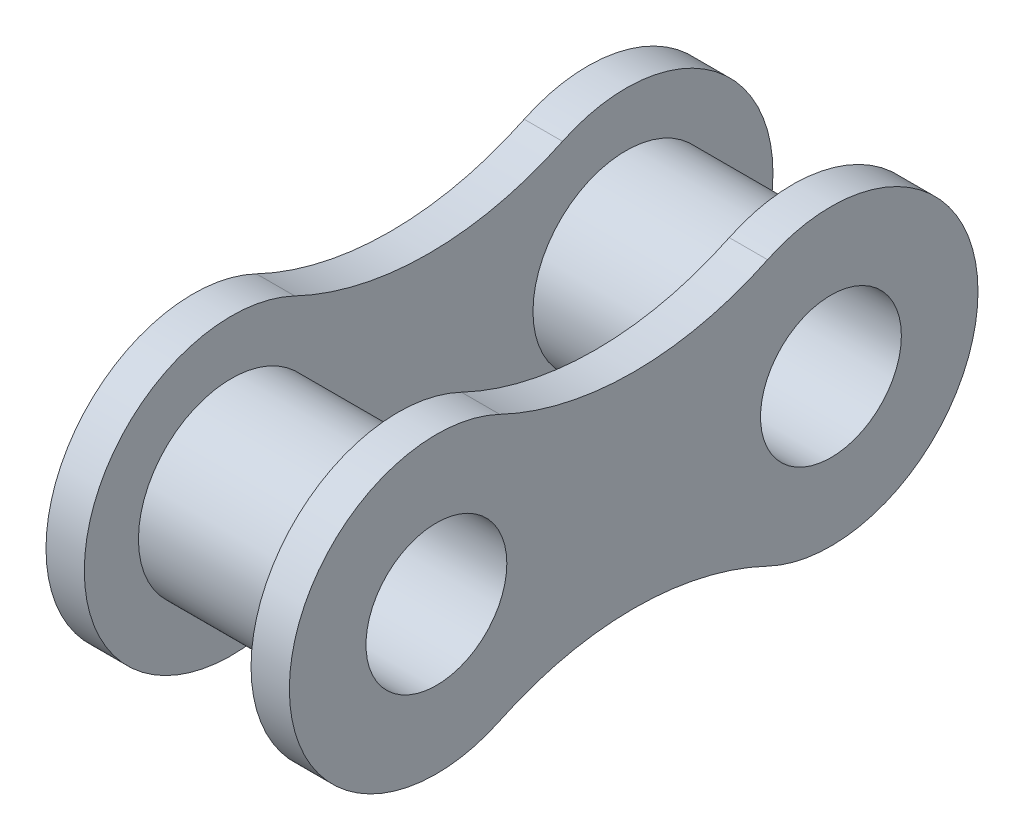
ISO-10303-21;
HEADER;
FILE_DESCRIPTION(('STEP AP214'),'2;1');
FILE_NAME('part.step','',(''),(''),'','','');
FILE_SCHEMA(('AUTOMOTIVE_DESIGN { 1 0 10303 214 1 1 1 1 }'));
ENDSEC;
DATA;
#1=APPLICATION_CONTEXT('core data for automotive mechanical design processes');
#2=APPLICATION_PROTOCOL_DEFINITION('international standard','automotive_design',2000,#1);
#3=PRODUCT_CONTEXT('',#1,'mechanical');
#4=PRODUCT('Part','Part','',(#3));
#5=PRODUCT_RELATED_PRODUCT_CATEGORY('part','',(#4));
#6=PRODUCT_DEFINITION_FORMATION('','',#4);
#7=PRODUCT_DEFINITION_CONTEXT('part definition',#1,'design');
#8=PRODUCT_DEFINITION('design','',#6,#7);
#9=PRODUCT_DEFINITION_SHAPE('','',#8);
#10=(LENGTH_UNIT() NAMED_UNIT(*) SI_UNIT(.MILLI.,.METRE.));
#11=(NAMED_UNIT(*) PLANE_ANGLE_UNIT() SI_UNIT($,.RADIAN.));
#12=(NAMED_UNIT(*) SI_UNIT($,.STERADIAN.) SOLID_ANGLE_UNIT());
#13=UNCERTAINTY_MEASURE_WITH_UNIT(LENGTH_MEASURE(1.E-05),#10,'distance_accuracy_value','');
#14=(GEOMETRIC_REPRESENTATION_CONTEXT(3) GLOBAL_UNCERTAINTY_ASSIGNED_CONTEXT((#13)) GLOBAL_UNIT_ASSIGNED_CONTEXT((#10,
#11,#12)) REPRESENTATION_CONTEXT('',''));
#15=CARTESIAN_POINT('',(0.,0.,0.));
#16=DIRECTION('',(0.,0.,1.));
#17=DIRECTION('',(1.,0.,0.));
#18=AXIS2_PLACEMENT_3D('',#15,#16,#17);
#19=CARTESIAN_POINT('',(11.75,0.,19.05));
#20=DIRECTION('',(-1.,0.,0.));
#21=DIRECTION('',(0.,0.,1.));
#22=AXIS2_PLACEMENT_3D('',#19,#20,#21);
#23=CYLINDRICAL_SURFACE('',#22,8.975);
#24=CARTESIAN_POINT('',(8.05,0.,19.05));
#25=DIRECTION('',(1.,0.,0.));
#26=DIRECTION('',(0.,0.,-1.));
#27=AXIS2_PLACEMENT_3D('',#24,#25,#26);
#28=CIRCLE('',#27,8.975);
#29=CARTESIAN_POINT('',(8.05,0.,10.075));
#30=VERTEX_POINT('',#29);
#31=EDGE_CURVE('E195',#30,#30,#28,.T.);
#32=ORIENTED_EDGE('',*,*,#31,.F.);
#33=EDGE_LOOP('',(#32));
#34=FACE_BOUND('',#33,.T.);
#35=CARTESIAN_POINT('',(-8.05,0.,19.05));
#36=DIRECTION('',(-1.,0.,0.));
#37=DIRECTION('',(0.,0.,1.));
#38=AXIS2_PLACEMENT_3D('',#35,#36,#37);
#39=CIRCLE('',#38,8.975);
#40=CARTESIAN_POINT('',(-8.05,0.,28.025));
#41=VERTEX_POINT('',#40);
#42=EDGE_CURVE('E11',#41,#41,#39,.T.);
#43=ORIENTED_EDGE('',*,*,#42,.F.);
#44=EDGE_LOOP('',(#43));
#45=FACE_BOUND('',#44,.T.);
#46=ADVANCED_FACE('F41',(#34,#45),#23,.T.);
#47=CARTESIAN_POINT('',(11.75,0.,-19.05));
#48=DIRECTION('',(-1.,0.,0.));
#49=DIRECTION('',(0.,0.,1.));
#50=AXIS2_PLACEMENT_3D('',#47,#48,#49);
#51=CYLINDRICAL_SURFACE('',#50,8.975);
#52=CARTESIAN_POINT('',(8.05,0.,-19.05));
#53=DIRECTION('',(1.,0.,0.));
#54=DIRECTION('',(0.,0.,-1.));
#55=AXIS2_PLACEMENT_3D('',#52,#53,#54);
#56=CIRCLE('',#55,8.975);
#57=CARTESIAN_POINT('',(8.05,0.,-28.025));
#58=VERTEX_POINT('',#57);
#59=EDGE_CURVE('E162',#58,#58,#56,.F.);
#60=ORIENTED_EDGE('',*,*,#59,.T.);
#61=EDGE_LOOP('',(#60));
#62=FACE_BOUND('',#61,.T.);
#63=CARTESIAN_POINT('',(-8.05,0.,-19.05));
#64=DIRECTION('',(-1.,0.,0.));
#65=DIRECTION('',(0.,0.,1.));
#66=AXIS2_PLACEMENT_3D('',#63,#64,#65);
#67=CIRCLE('',#66,8.975);
#68=CARTESIAN_POINT('',(-8.05,0.,-10.075));
#69=VERTEX_POINT('',#68);
#70=EDGE_CURVE('E49',#69,#69,#67,.T.);
#71=ORIENTED_EDGE('',*,*,#70,.F.);
#72=EDGE_LOOP('',(#71));
#73=FACE_BOUND('',#72,.T.);
#74=ADVANCED_FACE('F203',(#62,#73),#51,.T.);
#75=CARTESIAN_POINT('',(11.75,0.,19.05));
#76=DIRECTION('',(1.,0.,0.));
#77=DIRECTION('',(0.,0.,-1.));
#78=AXIS2_PLACEMENT_3D('',#75,#76,#77);
#79=PLANE('',#78);
#80=CARTESIAN_POINT('',(11.75,0.,19.05));
#81=DIRECTION('',(1.,0.,0.));
#82=DIRECTION('',(0.,0.,-1.));
#83=AXIS2_PLACEMENT_3D('',#80,#81,#82);
#84=CIRCLE('',#83,6.8);
#85=CARTESIAN_POINT('',(11.75,0.,12.25));
#86=VERTEX_POINT('',#85);
#87=EDGE_CURVE('E192',#86,#86,#84,.T.);
#88=ORIENTED_EDGE('',*,*,#87,.F.);
#89=EDGE_LOOP('',(#88));
#90=FACE_BOUND('',#89,.T.);
#91=CARTESIAN_POINT('',(11.75,39.8840506969891,0.));
#92=DIRECTION('',(-1.,0.,0.));
#93=DIRECTION('',(0.,0.,-1.));
#94=AXIS2_PLACEMENT_3D('',#91,#92,#93);
#95=CIRCLE('',#94,30.);
#96=CARTESIAN_POINT('',(11.75,12.8134280519739,-12.9298642533937));
#97=VERTEX_POINT('',#96);
#98=CARTESIAN_POINT('',(11.75,12.8134280519739,12.9298642533937));
#99=VERTEX_POINT('',#98);
#100=EDGE_CURVE('E167',#97,#99,#95,.T.);
#101=ORIENTED_EDGE('',*,*,#100,.T.);
#102=CARTESIAN_POINT('',(11.75,0.,19.05));
#103=DIRECTION('',(1.,0.,0.));
#104=DIRECTION('',(0.,0.,-1.));
#105=AXIS2_PLACEMENT_3D('',#102,#103,#104);
#106=CIRCLE('',#105,14.2);
#107=CARTESIAN_POINT('',(11.75,-12.8134280519739,12.9298642533937));
#108=VERTEX_POINT('',#107);
#109=EDGE_CURVE('E179',#99,#108,#106,.T.);
#110=ORIENTED_EDGE('',*,*,#109,.T.);
#111=CARTESIAN_POINT('',(11.75,-39.8840506969891,0.));
#112=DIRECTION('',(-1.,0.,0.));
#113=DIRECTION('',(0.,0.,-1.));
#114=AXIS2_PLACEMENT_3D('',#111,#112,#113);
#115=CIRCLE('',#114,30.);
#116=CARTESIAN_POINT('',(11.75,-12.8134280519739,-12.9298642533937));
#117=VERTEX_POINT('',#116);
#118=EDGE_CURVE('E182',#108,#117,#115,.T.);
#119=ORIENTED_EDGE('',*,*,#118,.T.);
#120=CARTESIAN_POINT('',(11.75,0.,-19.05));
#121=DIRECTION('',(1.,0.,0.));
#122=DIRECTION('',(0.,0.,-1.));
#123=AXIS2_PLACEMENT_3D('',#120,#121,#122);
#124=CIRCLE('',#123,14.2);
#125=EDGE_CURVE('E171',#117,#97,#124,.T.);
#126=ORIENTED_EDGE('',*,*,#125,.T.);
#127=EDGE_LOOP('',(#101,#110,#119,#126));
#128=FACE_BOUND('',#127,.T.);
#129=CARTESIAN_POINT('',(11.75,0.,-19.05));
#130=DIRECTION('',(1.,0.,0.));
#131=DIRECTION('',(0.,0.,-1.));
#132=AXIS2_PLACEMENT_3D('',#129,#130,#131);
#133=CIRCLE('',#132,6.8);
#134=CARTESIAN_POINT('',(11.75,0.,-25.85));
#135=VERTEX_POINT('',#134);
#136=EDGE_CURVE('E154',#135,#135,#133,.T.);
#137=ORIENTED_EDGE('',*,*,#136,.F.);
#138=EDGE_LOOP('',(#137));
#139=FACE_BOUND('',#138,.T.);
#140=ADVANCED_FACE('F205',(#90,#128,#139),#79,.T.);
#141=CARTESIAN_POINT('',(-11.75,0.,19.05));
#142=DIRECTION('',(1.,0.,0.));
#143=DIRECTION('',(0.,0.,-1.));
#144=AXIS2_PLACEMENT_3D('',#141,#142,#143);
#145=PLANE('',#144);
#146=CARTESIAN_POINT('',(-11.75,0.,19.05));
#147=DIRECTION('',(1.,0.,0.));
#148=DIRECTION('',(0.,0.,-1.));
#149=AXIS2_PLACEMENT_3D('',#146,#147,#148);
#150=CIRCLE('',#149,6.8);
#151=CARTESIAN_POINT('',(-11.75,0.,12.25));
#152=VERTEX_POINT('',#151);
#153=EDGE_CURVE('E187',#152,#152,#150,.T.);
#154=ORIENTED_EDGE('',*,*,#153,.T.);
#155=EDGE_LOOP('',(#154));
#156=FACE_BOUND('',#155,.T.);
#157=CARTESIAN_POINT('',(-11.75,0.,-19.05));
#158=DIRECTION('',(1.,0.,0.));
#159=DIRECTION('',(0.,0.,-1.));
#160=AXIS2_PLACEMENT_3D('',#157,#158,#159);
#161=CIRCLE('',#160,6.8);
#162=CARTESIAN_POINT('',(-11.75,0.,-25.85));
#163=VERTEX_POINT('',#162);
#164=EDGE_CURVE('E159',#163,#163,#161,.T.);
#165=ORIENTED_EDGE('',*,*,#164,.T.);
#166=EDGE_LOOP('',(#165));
#167=FACE_BOUND('',#166,.T.);
#168=CARTESIAN_POINT('',(-11.75,39.8840506969891,0.));
#169=DIRECTION('',(-1.,0.,0.));
#170=DIRECTION('',(0.,0.,-1.));
#171=AXIS2_PLACEMENT_3D('',#168,#169,#170);
#172=CIRCLE('',#171,30.);
#173=CARTESIAN_POINT('',(-11.75,12.8134280519739,-12.9298642533937));
#174=VERTEX_POINT('',#173);
#175=CARTESIAN_POINT('',(-11.75,12.8134280519739,12.9298642533937));
#176=VERTEX_POINT('',#175);
#177=EDGE_CURVE('E149',#174,#176,#172,.T.);
#178=ORIENTED_EDGE('',*,*,#177,.F.);
#179=CARTESIAN_POINT('',(-11.75,0.,-19.05));
#180=DIRECTION('',(1.,0.,0.));
#181=DIRECTION('',(0.,0.,-1.));
#182=AXIS2_PLACEMENT_3D('',#179,#180,#181);
#183=CIRCLE('',#182,14.2);
#184=CARTESIAN_POINT('',(-11.75,-12.8134280519739,-12.9298642533937));
#185=VERTEX_POINT('',#184);
#186=EDGE_CURVE('E132',#185,#174,#183,.T.);
#187=ORIENTED_EDGE('',*,*,#186,.F.);
#188=CARTESIAN_POINT('',(-11.75,-39.8840506969891,0.));
#189=DIRECTION('',(-1.,0.,0.));
#190=DIRECTION('',(0.,0.,-1.));
#191=AXIS2_PLACEMENT_3D('',#188,#189,#190);
#192=CIRCLE('',#191,30.);
#193=CARTESIAN_POINT('',(-11.75,-12.8134280519739,12.9298642533937));
#194=VERTEX_POINT('',#193);
#195=EDGE_CURVE('E144',#194,#185,#192,.T.);
#196=ORIENTED_EDGE('',*,*,#195,.F.);
#197=CARTESIAN_POINT('',(-11.75,0.,19.05));
#198=DIRECTION('',(1.,0.,0.));
#199=DIRECTION('',(0.,0.,-1.));
#200=AXIS2_PLACEMENT_3D('',#197,#198,#199);
#201=CIRCLE('',#200,14.2);
#202=EDGE_CURVE('E142',#176,#194,#201,.T.);
#203=ORIENTED_EDGE('',*,*,#202,.F.);
#204=EDGE_LOOP('',(#178,#187,#196,#203));
#205=FACE_BOUND('',#204,.T.);
#206=ADVANCED_FACE('F213',(#156,#167,#205),#145,.F.);
#207=CARTESIAN_POINT('',(11.75,0.,19.05));
#208=DIRECTION('',(-1.,0.,0.));
#209=DIRECTION('',(0.,0.,1.));
#210=AXIS2_PLACEMENT_3D('',#207,#208,#209);
#211=CYLINDRICAL_SURFACE('',#210,6.8);
#212=ORIENTED_EDGE('',*,*,#87,.T.);
#213=EDGE_LOOP('',(#212));
#214=FACE_BOUND('',#213,.T.);
#215=ORIENTED_EDGE('',*,*,#153,.F.);
#216=EDGE_LOOP('',(#215));
#217=FACE_BOUND('',#216,.T.);
#218=ADVANCED_FACE('F240',(#214,#217),#211,.F.);
#219=CARTESIAN_POINT('',(8.05,39.8840506969891,0.));
#220=DIRECTION('',(1.,0.,0.));
#221=DIRECTION('',(0.,0.,-1.));
#222=AXIS2_PLACEMENT_3D('',#219,#220,#221);
#223=CYLINDRICAL_SURFACE('',#222,30.);
#224=ORIENTED_EDGE('',*,*,#100,.F.);
#225=DIRECTION('',(1.,0.,0.));
#226=VECTOR('',#225,1.);
#227=CARTESIAN_POINT('',(8.05,12.8134280519739,-12.9298642533937));
#228=LINE('',#227,#226);
#229=CARTESIAN_POINT('',(8.05,12.8134280519739,-12.9298642533937));
#230=VERTEX_POINT('',#229);
#231=EDGE_CURVE('E57',#230,#97,#228,.T.);
#232=ORIENTED_EDGE('',*,*,#231,.F.);
#233=CARTESIAN_POINT('',(8.05,39.8840506969891,0.));
#234=DIRECTION('',(-1.,0.,0.));
#235=DIRECTION('',(0.,0.,-1.));
#236=AXIS2_PLACEMENT_3D('',#233,#234,#235);
#237=CIRCLE('',#236,30.);
#238=CARTESIAN_POINT('',(8.05,12.8134280519739,12.9298642533937));
#239=VERTEX_POINT('',#238);
#240=EDGE_CURVE('E168',#230,#239,#237,.T.);
#241=ORIENTED_EDGE('',*,*,#240,.T.);
#242=DIRECTION('',(1.,0.,0.));
#243=VECTOR('',#242,1.);
#244=CARTESIAN_POINT('',(8.05,12.8134280519739,12.9298642533937));
#245=LINE('',#244,#243);
#246=EDGE_CURVE('E86',#239,#99,#245,.T.);
#247=ORIENTED_EDGE('',*,*,#246,.T.);
#248=EDGE_LOOP('',(#224,#232,#241,#247));
#249=FACE_BOUND('',#248,.T.);
#250=ADVANCED_FACE('F233',(#249),#223,.F.);
#251=CARTESIAN_POINT('',(8.05,0.,-19.05));
#252=DIRECTION('',(1.,0.,0.));
#253=DIRECTION('',(0.,0.,-1.));
#254=AXIS2_PLACEMENT_3D('',#251,#252,#253);
#255=CYLINDRICAL_SURFACE('',#254,14.2);
#256=ORIENTED_EDGE('',*,*,#125,.F.);
#257=DIRECTION('',(1.,0.,0.));
#258=VECTOR('',#257,1.);
#259=CARTESIAN_POINT('',(8.05,-12.8134280519739,-12.9298642533937));
#260=LINE('',#259,#258);
#261=CARTESIAN_POINT('',(8.05,-12.8134280519739,-12.9298642533937));
#262=VERTEX_POINT('',#261);
#263=EDGE_CURVE('E75',#262,#117,#260,.T.);
#264=ORIENTED_EDGE('',*,*,#263,.F.);
#265=CARTESIAN_POINT('',(8.05,0.,-19.05));
#266=DIRECTION('',(1.,0.,0.));
#267=DIRECTION('',(0.,0.,-1.));
#268=AXIS2_PLACEMENT_3D('',#265,#266,#267);
#269=CIRCLE('',#268,14.2);
#270=EDGE_CURVE('E175',#262,#230,#269,.T.);
#271=ORIENTED_EDGE('',*,*,#270,.T.);
#272=ORIENTED_EDGE('',*,*,#231,.T.);
#273=EDGE_LOOP('',(#256,#264,#271,#272));
#274=FACE_BOUND('',#273,.T.);
#275=ADVANCED_FACE('F229',(#274),#255,.T.);
#276=CARTESIAN_POINT('',(8.05,-39.8840506969891,0.));
#277=DIRECTION('',(1.,0.,0.));
#278=DIRECTION('',(0.,0.,-1.));
#279=AXIS2_PLACEMENT_3D('',#276,#277,#278);
#280=CYLINDRICAL_SURFACE('',#279,30.);
#281=ORIENTED_EDGE('',*,*,#118,.F.);
#282=DIRECTION('',(1.,0.,0.));
#283=VECTOR('',#282,1.);
#284=CARTESIAN_POINT('',(8.05,-12.8134280519739,12.9298642533937));
#285=LINE('',#284,#283);
#286=CARTESIAN_POINT('',(8.05,-12.8134280519739,12.9298642533937));
#287=VERTEX_POINT('',#286);
#288=EDGE_CURVE('E189',#287,#108,#285,.T.);
#289=ORIENTED_EDGE('',*,*,#288,.F.);
#290=CARTESIAN_POINT('',(8.05,-39.8840506969891,0.));
#291=DIRECTION('',(-1.,0.,0.));
#292=DIRECTION('',(0.,0.,-1.));
#293=AXIS2_PLACEMENT_3D('',#290,#291,#292);
#294=CIRCLE('',#293,30.);
#295=EDGE_CURVE('E173',#287,#262,#294,.T.);
#296=ORIENTED_EDGE('',*,*,#295,.T.);
#297=ORIENTED_EDGE('',*,*,#263,.T.);
#298=EDGE_LOOP('',(#281,#289,#296,#297));
#299=FACE_BOUND('',#298,.T.);
#300=ADVANCED_FACE('F232',(#299),#280,.F.);
#301=CARTESIAN_POINT('',(8.05,0.,19.05));
#302=DIRECTION('',(1.,0.,0.));
#303=DIRECTION('',(0.,0.,-1.));
#304=AXIS2_PLACEMENT_3D('',#301,#302,#303);
#305=CYLINDRICAL_SURFACE('',#304,14.2);
#306=ORIENTED_EDGE('',*,*,#109,.F.);
#307=ORIENTED_EDGE('',*,*,#246,.F.);
#308=CARTESIAN_POINT('',(8.05,0.,19.05));
#309=DIRECTION('',(1.,0.,0.));
#310=DIRECTION('',(0.,0.,-1.));
#311=AXIS2_PLACEMENT_3D('',#308,#309,#310);
#312=CIRCLE('',#311,14.2);
#313=EDGE_CURVE('E170',#239,#287,#312,.T.);
#314=ORIENTED_EDGE('',*,*,#313,.T.);
#315=ORIENTED_EDGE('',*,*,#288,.T.);
#316=EDGE_LOOP('',(#306,#307,#314,#315));
#317=FACE_BOUND('',#316,.T.);
#318=ADVANCED_FACE('F227',(#317),#305,.T.);
#319=CARTESIAN_POINT('',(8.05,19.9420253484946,-9.525));
#320=DIRECTION('',(1.,0.,0.));
#321=DIRECTION('',(0.,0.,-1.));
#322=AXIS2_PLACEMENT_3D('',#319,#320,#321);
#323=PLANE('',#322);
#324=ORIENTED_EDGE('',*,*,#59,.F.);
#325=EDGE_LOOP('',(#324));
#326=FACE_BOUND('',#325,.T.);
#327=ORIENTED_EDGE('',*,*,#31,.T.);
#328=EDGE_LOOP('',(#327));
#329=FACE_BOUND('',#328,.T.);
#330=ORIENTED_EDGE('',*,*,#240,.F.);
#331=ORIENTED_EDGE('',*,*,#270,.F.);
#332=ORIENTED_EDGE('',*,*,#295,.F.);
#333=ORIENTED_EDGE('',*,*,#313,.F.);
#334=EDGE_LOOP('',(#330,#331,#332,#333));
#335=FACE_BOUND('',#334,.T.);
#336=ADVANCED_FACE('F223',(#326,#329,#335),#323,.F.);
#337=CARTESIAN_POINT('',(11.75,0.,-19.05));
#338=DIRECTION('',(-1.,0.,0.));
#339=DIRECTION('',(0.,0.,1.));
#340=AXIS2_PLACEMENT_3D('',#337,#338,#339);
#341=CYLINDRICAL_SURFACE('',#340,6.8);
#342=ORIENTED_EDGE('',*,*,#136,.T.);
#343=EDGE_LOOP('',(#342));
#344=FACE_BOUND('',#343,.T.);
#345=ORIENTED_EDGE('',*,*,#164,.F.);
#346=EDGE_LOOP('',(#345));
#347=FACE_BOUND('',#346,.T.);
#348=ADVANCED_FACE('F220',(#344,#347),#341,.F.);
#349=CARTESIAN_POINT('',(-8.05,19.9420253484946,-9.525));
#350=DIRECTION('',(-1.,0.,0.));
#351=DIRECTION('',(0.,0.,-1.));
#352=AXIS2_PLACEMENT_3D('',#349,#350,#351);
#353=PLANE('',#352);
#354=CARTESIAN_POINT('',(-8.05,39.8840506969891,0.));
#355=DIRECTION('',(-1.,0.,0.));
#356=DIRECTION('',(0.,0.,-1.));
#357=AXIS2_PLACEMENT_3D('',#354,#355,#356);
#358=CIRCLE('',#357,30.);
#359=CARTESIAN_POINT('',(-8.05,12.8134280519739,-12.9298642533937));
#360=VERTEX_POINT('',#359);
#361=CARTESIAN_POINT('',(-8.05,12.8134280519739,12.9298642533937));
#362=VERTEX_POINT('',#361);
#363=EDGE_CURVE('E120',#360,#362,#358,.T.);
#364=ORIENTED_EDGE('',*,*,#363,.T.);
#365=CARTESIAN_POINT('',(-8.05,0.,19.05));
#366=DIRECTION('',(1.,0.,0.));
#367=DIRECTION('',(0.,0.,-1.));
#368=AXIS2_PLACEMENT_3D('',#365,#366,#367);
#369=CIRCLE('',#368,14.2);
#370=CARTESIAN_POINT('',(-8.05,-12.8134280519739,12.9298642533937));
#371=VERTEX_POINT('',#370);
#372=EDGE_CURVE('E137',#362,#371,#369,.T.);
#373=ORIENTED_EDGE('',*,*,#372,.T.);
#374=CARTESIAN_POINT('',(-8.05,-39.8840506969891,0.));
#375=DIRECTION('',(-1.,0.,0.));
#376=DIRECTION('',(0.,0.,-1.));
#377=AXIS2_PLACEMENT_3D('',#374,#375,#376);
#378=CIRCLE('',#377,30.);
#379=CARTESIAN_POINT('',(-8.05,-12.8134280519739,-12.9298642533937));
#380=VERTEX_POINT('',#379);
#381=EDGE_CURVE('E123',#371,#380,#378,.T.);
#382=ORIENTED_EDGE('',*,*,#381,.T.);
#383=CARTESIAN_POINT('',(-8.05,0.,-19.05));
#384=DIRECTION('',(1.,0.,0.));
#385=DIRECTION('',(0.,0.,-1.));
#386=AXIS2_PLACEMENT_3D('',#383,#384,#385);
#387=CIRCLE('',#386,14.2);
#388=EDGE_CURVE('E115',#380,#360,#387,.T.);
#389=ORIENTED_EDGE('',*,*,#388,.T.);
#390=EDGE_LOOP('',(#364,#373,#382,#389));
#391=FACE_BOUND('',#390,.T.);
#392=ORIENTED_EDGE('',*,*,#42,.T.);
#393=EDGE_LOOP('',(#392));
#394=FACE_BOUND('',#393,.T.);
#395=ORIENTED_EDGE('',*,*,#70,.T.);
#396=EDGE_LOOP('',(#395));
#397=FACE_BOUND('',#396,.T.);
#398=ADVANCED_FACE('F117',(#391,#394,#397),#353,.F.);
#399=CARTESIAN_POINT('',(-8.05,39.8840506969891,0.));
#400=DIRECTION('',(-1.,0.,0.));
#401=DIRECTION('',(0.,0.,1.));
#402=AXIS2_PLACEMENT_3D('',#399,#400,#401);
#403=CYLINDRICAL_SURFACE('',#402,30.);
#404=ORIENTED_EDGE('',*,*,#177,.T.);
#405=DIRECTION('',(-1.,0.,0.));
#406=VECTOR('',#405,1.);
#407=CARTESIAN_POINT('',(-8.05,12.8134280519739,12.9298642533937));
#408=LINE('',#407,#406);
#409=EDGE_CURVE('E141',#362,#176,#408,.T.);
#410=ORIENTED_EDGE('',*,*,#409,.F.);
#411=ORIENTED_EDGE('',*,*,#363,.F.);
#412=DIRECTION('',(-1.,0.,0.));
#413=VECTOR('',#412,1.);
#414=CARTESIAN_POINT('',(-8.05,12.8134280519739,-12.9298642533937));
#415=LINE('',#414,#413);
#416=EDGE_CURVE('E129',#360,#174,#415,.T.);
#417=ORIENTED_EDGE('',*,*,#416,.T.);
#418=EDGE_LOOP('',(#404,#410,#411,#417));
#419=FACE_BOUND('',#418,.T.);
#420=ADVANCED_FACE('F139',(#419),#403,.F.);
#421=CARTESIAN_POINT('',(-8.05,0.,19.05));
#422=DIRECTION('',(-1.,0.,0.));
#423=DIRECTION('',(0.,0.,1.));
#424=AXIS2_PLACEMENT_3D('',#421,#422,#423);
#425=CYLINDRICAL_SURFACE('',#424,14.2);
#426=ORIENTED_EDGE('',*,*,#202,.T.);
#427=DIRECTION('',(-1.,0.,0.));
#428=VECTOR('',#427,1.);
#429=CARTESIAN_POINT('',(-8.05,-12.8134280519739,12.9298642533937));
#430=LINE('',#429,#428);
#431=EDGE_CURVE('E155',#371,#194,#430,.T.);
#432=ORIENTED_EDGE('',*,*,#431,.F.);
#433=ORIENTED_EDGE('',*,*,#372,.F.);
#434=ORIENTED_EDGE('',*,*,#409,.T.);
#435=EDGE_LOOP('',(#426,#432,#433,#434));
#436=FACE_BOUND('',#435,.T.);
#437=ADVANCED_FACE('F254',(#436),#425,.T.);
#438=CARTESIAN_POINT('',(-8.05,-39.8840506969891,0.));
#439=DIRECTION('',(-1.,0.,0.));
#440=DIRECTION('',(0.,0.,1.));
#441=AXIS2_PLACEMENT_3D('',#438,#439,#440);
#442=CYLINDRICAL_SURFACE('',#441,30.);
#443=ORIENTED_EDGE('',*,*,#195,.T.);
#444=DIRECTION('',(-1.,0.,0.));
#445=VECTOR('',#444,1.);
#446=CARTESIAN_POINT('',(-8.05,-12.8134280519739,-12.9298642533937));
#447=LINE('',#446,#445);
#448=EDGE_CURVE('E136',#380,#185,#447,.T.);
#449=ORIENTED_EDGE('',*,*,#448,.F.);
#450=ORIENTED_EDGE('',*,*,#381,.F.);
#451=ORIENTED_EDGE('',*,*,#431,.T.);
#452=EDGE_LOOP('',(#443,#449,#450,#451));
#453=FACE_BOUND('',#452,.T.);
#454=ADVANCED_FACE('F256',(#453),#442,.F.);
#455=CARTESIAN_POINT('',(-8.05,0.,-19.05));
#456=DIRECTION('',(-1.,0.,0.));
#457=DIRECTION('',(0.,0.,1.));
#458=AXIS2_PLACEMENT_3D('',#455,#456,#457);
#459=CYLINDRICAL_SURFACE('',#458,14.2);
#460=ORIENTED_EDGE('',*,*,#186,.T.);
#461=ORIENTED_EDGE('',*,*,#416,.F.);
#462=ORIENTED_EDGE('',*,*,#388,.F.);
#463=ORIENTED_EDGE('',*,*,#448,.T.);
#464=EDGE_LOOP('',(#460,#461,#462,#463));
#465=FACE_BOUND('',#464,.T.);
#466=ADVANCED_FACE('F130',(#465),#459,.T.);
#467=CLOSED_SHELL('',(#46,#74,#140,#206,#218,#250,#275,#300,#318,#336,#348,#398,#420,#437,#454,#466));
#468=MANIFOLD_SOLID_BREP('B2',#467);
#469=ADVANCED_BREP_SHAPE_REPRESENTATION('',(#18,#468),#14);
#470=SHAPE_DEFINITION_REPRESENTATION(#9,#469);
ENDSEC;
END-ISO-10303-21;
